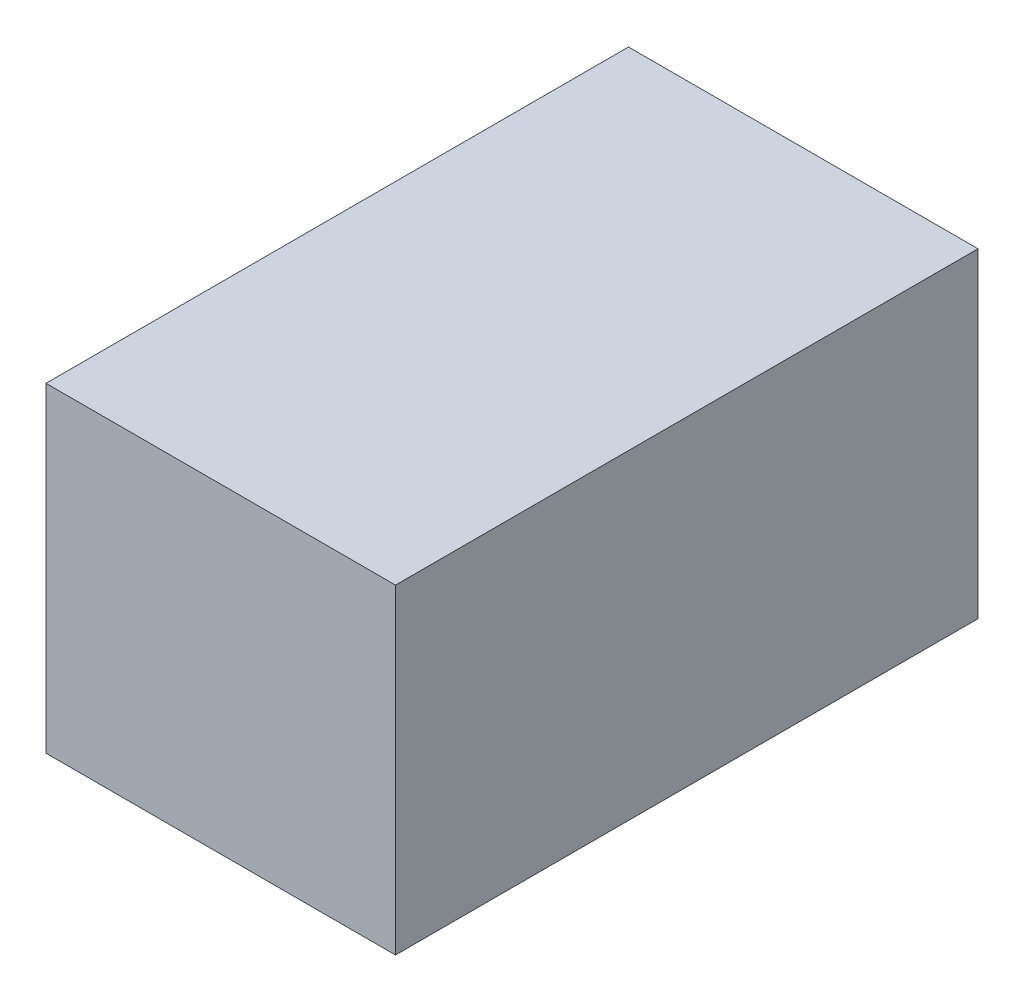
ISO-10303-21;
HEADER;
FILE_DESCRIPTION(('STEP AP214'),'2;1');
FILE_NAME('part.step','',(''),(''),'','','');
FILE_SCHEMA(('AUTOMOTIVE_DESIGN { 1 0 10303 214 1 1 1 1 }'));
ENDSEC;
DATA;
#1=APPLICATION_CONTEXT('core data for automotive mechanical design processes');
#2=APPLICATION_PROTOCOL_DEFINITION('international standard','automotive_design',2000,#1);
#3=PRODUCT_CONTEXT('',#1,'mechanical');
#4=PRODUCT('Part','Part','',(#3));
#5=PRODUCT_RELATED_PRODUCT_CATEGORY('part','',(#4));
#6=PRODUCT_DEFINITION_FORMATION('','',#4);
#7=PRODUCT_DEFINITION_CONTEXT('part definition',#1,'design');
#8=PRODUCT_DEFINITION('design','',#6,#7);
#9=PRODUCT_DEFINITION_SHAPE('','',#8);
#10=(LENGTH_UNIT() NAMED_UNIT(*) SI_UNIT(.MILLI.,.METRE.));
#11=(NAMED_UNIT(*) PLANE_ANGLE_UNIT() SI_UNIT($,.RADIAN.));
#12=(NAMED_UNIT(*) SI_UNIT($,.STERADIAN.) SOLID_ANGLE_UNIT());
#13=UNCERTAINTY_MEASURE_WITH_UNIT(LENGTH_MEASURE(1.E-05),#10,'distance_accuracy_value','');
#14=(GEOMETRIC_REPRESENTATION_CONTEXT(3) GLOBAL_UNCERTAINTY_ASSIGNED_CONTEXT((#13)) GLOBAL_UNIT_ASSIGNED_CONTEXT((#10,
#11,#12)) REPRESENTATION_CONTEXT('',''));
#15=CARTESIAN_POINT('',(0.,0.,0.));
#16=DIRECTION('',(0.,0.,1.));
#17=DIRECTION('',(1.,0.,0.));
#18=AXIS2_PLACEMENT_3D('',#15,#16,#17);
#19=CARTESIAN_POINT('',(-6.,5.5,20.));
#20=DIRECTION('',(1.,0.,0.));
#21=DIRECTION('',(0.,1.,0.));
#22=AXIS2_PLACEMENT_3D('',#19,#20,#21);
#23=PLANE('',#22);
#24=DIRECTION('',(0.,-1.,0.));
#25=VECTOR('',#24,1.);
#26=CARTESIAN_POINT('',(-6.,5.5,0.));
#27=LINE('',#26,#25);
#28=CARTESIAN_POINT('',(-6.,5.5,0.));
#29=VERTEX_POINT('',#28);
#30=CARTESIAN_POINT('',(-6.,-5.5,0.));
#31=VERTEX_POINT('',#30);
#32=EDGE_CURVE('E103',#29,#31,#27,.T.);
#33=ORIENTED_EDGE('',*,*,#32,.T.);
#34=DIRECTION('',(0.,0.,-1.));
#35=VECTOR('',#34,1.);
#36=CARTESIAN_POINT('',(-6.,-5.5,20.));
#37=LINE('',#36,#35);
#38=CARTESIAN_POINT('',(-6.,-5.5,20.));
#39=VERTEX_POINT('',#38);
#40=EDGE_CURVE('E44',#39,#31,#37,.T.);
#41=ORIENTED_EDGE('',*,*,#40,.F.);
#42=DIRECTION('',(0.,-1.,0.));
#43=VECTOR('',#42,1.);
#44=CARTESIAN_POINT('',(-6.,5.5,20.));
#45=LINE('',#44,#43);
#46=CARTESIAN_POINT('',(-6.,5.5,20.));
#47=VERTEX_POINT('',#46);
#48=EDGE_CURVE('E89',#47,#39,#45,.T.);
#49=ORIENTED_EDGE('',*,*,#48,.F.);
#50=DIRECTION('',(0.,0.,-1.));
#51=VECTOR('',#50,1.);
#52=CARTESIAN_POINT('',(-6.,5.5,20.));
#53=LINE('',#52,#51);
#54=EDGE_CURVE('E99',#47,#29,#53,.T.);
#55=ORIENTED_EDGE('',*,*,#54,.T.);
#56=EDGE_LOOP('',(#33,#41,#49,#55));
#57=FACE_BOUND('',#56,.T.);
#58=ADVANCED_FACE('F35',(#57),#23,.F.);
#59=CARTESIAN_POINT('',(6.,-5.5,20.));
#60=DIRECTION('',(0.,1.,0.));
#61=DIRECTION('',(-1.,0.,0.));
#62=AXIS2_PLACEMENT_3D('',#59,#60,#61);
#63=PLANE('',#62);
#64=DIRECTION('',(1.,0.,0.));
#65=VECTOR('',#64,1.);
#66=CARTESIAN_POINT('',(6.,-5.5,0.));
#67=LINE('',#66,#65);
#68=CARTESIAN_POINT('',(6.,-5.5,0.));
#69=VERTEX_POINT('',#68);
#70=EDGE_CURVE('E94',#31,#69,#67,.T.);
#71=ORIENTED_EDGE('',*,*,#70,.T.);
#72=DIRECTION('',(0.,0.,-1.));
#73=VECTOR('',#72,1.);
#74=CARTESIAN_POINT('',(6.,-5.5,20.));
#75=LINE('',#74,#73);
#76=CARTESIAN_POINT('',(6.,-5.5,20.));
#77=VERTEX_POINT('',#76);
#78=EDGE_CURVE('E92',#77,#69,#75,.T.);
#79=ORIENTED_EDGE('',*,*,#78,.F.);
#80=DIRECTION('',(1.,0.,0.));
#81=VECTOR('',#80,1.);
#82=CARTESIAN_POINT('',(6.,-5.5,20.));
#83=LINE('',#82,#81);
#84=EDGE_CURVE('E84',#39,#77,#83,.T.);
#85=ORIENTED_EDGE('',*,*,#84,.F.);
#86=ORIENTED_EDGE('',*,*,#40,.T.);
#87=EDGE_LOOP('',(#71,#79,#85,#86));
#88=FACE_BOUND('',#87,.T.);
#89=ADVANCED_FACE('F93',(#88),#63,.F.);
#90=CARTESIAN_POINT('',(6.,5.5,20.));
#91=DIRECTION('',(-1.,0.,0.));
#92=DIRECTION('',(0.,-1.,0.));
#93=AXIS2_PLACEMENT_3D('',#90,#91,#92);
#94=PLANE('',#93);
#95=DIRECTION('',(0.,1.,0.));
#96=VECTOR('',#95,1.);
#97=CARTESIAN_POINT('',(6.,5.5,0.));
#98=LINE('',#97,#96);
#99=CARTESIAN_POINT('',(6.,5.5,0.));
#100=VERTEX_POINT('',#99);
#101=EDGE_CURVE('E70',#69,#100,#98,.T.);
#102=ORIENTED_EDGE('',*,*,#101,.T.);
#103=DIRECTION('',(0.,0.,-1.));
#104=VECTOR('',#103,1.);
#105=CARTESIAN_POINT('',(6.,5.5,20.));
#106=LINE('',#105,#104);
#107=CARTESIAN_POINT('',(6.,5.5,20.));
#108=VERTEX_POINT('',#107);
#109=EDGE_CURVE('E95',#108,#100,#106,.T.);
#110=ORIENTED_EDGE('',*,*,#109,.F.);
#111=DIRECTION('',(0.,1.,0.));
#112=VECTOR('',#111,1.);
#113=CARTESIAN_POINT('',(6.,5.5,20.));
#114=LINE('',#113,#112);
#115=EDGE_CURVE('E87',#77,#108,#114,.T.);
#116=ORIENTED_EDGE('',*,*,#115,.F.);
#117=ORIENTED_EDGE('',*,*,#78,.T.);
#118=EDGE_LOOP('',(#102,#110,#116,#117));
#119=FACE_BOUND('',#118,.T.);
#120=ADVANCED_FACE('F97',(#119),#94,.F.);
#121=CARTESIAN_POINT('',(6.,5.5,20.));
#122=DIRECTION('',(0.,-1.,0.));
#123=DIRECTION('',(1.,0.,0.));
#124=AXIS2_PLACEMENT_3D('',#121,#122,#123);
#125=PLANE('',#124);
#126=DIRECTION('',(-1.,0.,0.));
#127=VECTOR('',#126,1.);
#128=CARTESIAN_POINT('',(6.,5.5,0.));
#129=LINE('',#128,#127);
#130=EDGE_CURVE('E76',#100,#29,#129,.T.);
#131=ORIENTED_EDGE('',*,*,#130,.T.);
#132=ORIENTED_EDGE('',*,*,#54,.F.);
#133=DIRECTION('',(-1.,0.,0.));
#134=VECTOR('',#133,1.);
#135=CARTESIAN_POINT('',(6.,5.5,20.));
#136=LINE('',#135,#134);
#137=EDGE_CURVE('E53',#108,#47,#136,.T.);
#138=ORIENTED_EDGE('',*,*,#137,.F.);
#139=ORIENTED_EDGE('',*,*,#109,.T.);
#140=EDGE_LOOP('',(#131,#132,#138,#139));
#141=FACE_BOUND('',#140,.T.);
#142=ADVANCED_FACE('F126',(#141),#125,.F.);
#143=CARTESIAN_POINT('',(0.,0.,20.));
#144=DIRECTION('',(0.,0.,-1.));
#145=DIRECTION('',(-1.,0.,0.));
#146=AXIS2_PLACEMENT_3D('',#143,#144,#145);
#147=PLANE('',#146);
#148=ORIENTED_EDGE('',*,*,#48,.T.);
#149=ORIENTED_EDGE('',*,*,#84,.T.);
#150=ORIENTED_EDGE('',*,*,#115,.T.);
#151=ORIENTED_EDGE('',*,*,#137,.T.);
#152=EDGE_LOOP('',(#148,#149,#150,#151));
#153=FACE_BOUND('',#152,.T.);
#154=ADVANCED_FACE('F85',(#153),#147,.F.);
#155=CARTESIAN_POINT('',(0.,0.,0.));
#156=DIRECTION('',(0.,0.,-1.));
#157=DIRECTION('',(-1.,0.,0.));
#158=AXIS2_PLACEMENT_3D('',#155,#156,#157);
#159=PLANE('',#158);
#160=CARTESIAN_POINT('',(0.,0.,0.));
#161=DIRECTION('',(0.,0.,-1.));
#162=DIRECTION('',(-1.,0.,0.));
#163=AXIS2_PLACEMENT_3D('',#160,#161,#162);
#164=CIRCLE('',#163,1.5);
#165=CARTESIAN_POINT('',(-1.5,0.,0.));
#166=VERTEX_POINT('',#165);
#167=EDGE_CURVE('E11',#166,#166,#164,.T.);
#168=ORIENTED_EDGE('',*,*,#167,.F.);
#169=EDGE_LOOP('',(#168));
#170=FACE_BOUND('',#169,.T.);
#171=ORIENTED_EDGE('',*,*,#32,.F.);
#172=ORIENTED_EDGE('',*,*,#130,.F.);
#173=ORIENTED_EDGE('',*,*,#101,.F.);
#174=ORIENTED_EDGE('',*,*,#70,.F.);
#175=EDGE_LOOP('',(#171,#172,#173,#174));
#176=FACE_BOUND('',#175,.T.);
#177=ADVANCED_FACE('F114',(#170,#176),#159,.T.);
#178=CARTESIAN_POINT('',(0.,0.,-1.));
#179=DIRECTION('',(0.,0.,1.));
#180=DIRECTION('',(1.,0.,0.));
#181=AXIS2_PLACEMENT_3D('',#178,#179,#180);
#182=CYLINDRICAL_SURFACE('',#181,1.5);
#183=CARTESIAN_POINT('',(0.,0.,-1.));
#184=DIRECTION('',(0.,0.,-1.));
#185=DIRECTION('',(-1.,0.,0.));
#186=AXIS2_PLACEMENT_3D('',#183,#184,#185);
#187=CIRCLE('',#186,1.5);
#188=CARTESIAN_POINT('',(-1.5,0.,-1.));
#189=VERTEX_POINT('',#188);
#190=EDGE_CURVE('E106',#189,#189,#187,.T.);
#191=ORIENTED_EDGE('',*,*,#190,.F.);
#192=EDGE_LOOP('',(#191));
#193=FACE_BOUND('',#192,.T.);
#194=ORIENTED_EDGE('',*,*,#167,.T.);
#195=EDGE_LOOP('',(#194));
#196=FACE_BOUND('',#195,.T.);
#197=ADVANCED_FACE('F116',(#193,#196),#182,.T.);
#198=CARTESIAN_POINT('',(0.,0.,-1.));
#199=DIRECTION('',(0.,0.,-1.));
#200=DIRECTION('',(-1.,0.,0.));
#201=AXIS2_PLACEMENT_3D('',#198,#199,#200);
#202=PLANE('',#201);
#203=CARTESIAN_POINT('',(0.,0.,-1.));
#204=DIRECTION('',(0.,0.,-1.));
#205=DIRECTION('',(-1.,0.,0.));
#206=AXIS2_PLACEMENT_3D('',#203,#204,#205);
#207=CIRCLE('',#206,0.75);
#208=CARTESIAN_POINT('',(-0.75,0.,-1.));
#209=VERTEX_POINT('',#208);
#210=EDGE_CURVE('E38',#209,#209,#207,.F.);
#211=ORIENTED_EDGE('',*,*,#210,.T.);
#212=EDGE_LOOP('',(#211));
#213=FACE_BOUND('',#212,.T.);
#214=ORIENTED_EDGE('',*,*,#190,.T.);
#215=EDGE_LOOP('',(#214));
#216=FACE_BOUND('',#215,.T.);
#217=ADVANCED_FACE('F123',(#213,#216),#202,.T.);
#218=CARTESIAN_POINT('',(0.,0.,-4.5));
#219=DIRECTION('',(0.,0.,1.));
#220=DIRECTION('',(1.,0.,0.));
#221=AXIS2_PLACEMENT_3D('',#218,#219,#220);
#222=CYLINDRICAL_SURFACE('',#221,0.75);
#223=ORIENTED_EDGE('',*,*,#210,.F.);
#224=EDGE_LOOP('',(#223));
#225=FACE_BOUND('',#224,.T.);
#226=CARTESIAN_POINT('',(0.,0.,-4.5));
#227=DIRECTION('',(0.,0.,-1.));
#228=DIRECTION('',(-1.,0.,0.));
#229=AXIS2_PLACEMENT_3D('',#226,#227,#228);
#230=CIRCLE('',#229,0.75);
#231=CARTESIAN_POINT('',(-0.75,0.,-4.5));
#232=VERTEX_POINT('',#231);
#233=EDGE_CURVE('E192',#232,#232,#230,.T.);
#234=ORIENTED_EDGE('',*,*,#233,.F.);
#235=EDGE_LOOP('',(#234));
#236=FACE_BOUND('',#235,.T.);
#237=ADVANCED_FACE('F166',(#225,#236),#222,.T.);
#238=CARTESIAN_POINT('',(0.,0.,-4.5));
#239=DIRECTION('',(0.,0.,-1.));
#240=DIRECTION('',(-1.,0.,0.));
#241=AXIS2_PLACEMENT_3D('',#238,#239,#240);
#242=PLANE('',#241);
#243=ORIENTED_EDGE('',*,*,#233,.T.);
#244=EDGE_LOOP('',(#243));
#245=FACE_BOUND('',#244,.T.);
#246=ADVANCED_FACE('F176',(#245),#242,.T.);
#247=CLOSED_SHELL('',(#58,#89,#120,#142,#154,#177,#197,#217,#237,#246));
#248=MANIFOLD_SOLID_BREP('B2',#247);
#249=ADVANCED_BREP_SHAPE_REPRESENTATION('',(#18,#248),#14);
#250=SHAPE_DEFINITION_REPRESENTATION(#9,#249);
ENDSEC;
END-ISO-10303-21;
